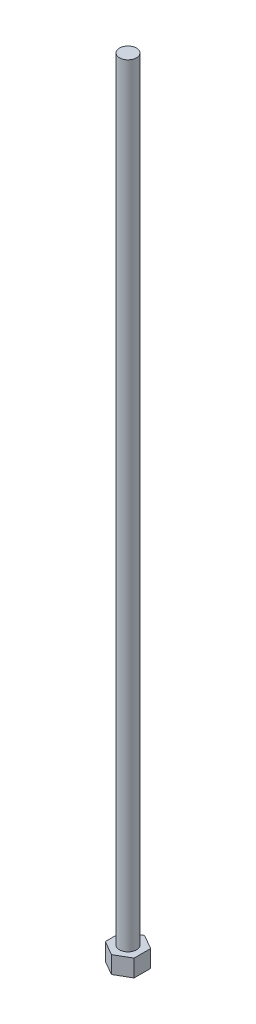
ISO-10303-21;
HEADER;
FILE_DESCRIPTION(('STEP AP214'),'2;1');
FILE_NAME('part.step','',(''),(''),'','','');
FILE_SCHEMA(('AUTOMOTIVE_DESIGN { 1 0 10303 214 1 1 1 1 }'));
ENDSEC;
DATA;
#1=APPLICATION_CONTEXT('core data for automotive mechanical design processes');
#2=APPLICATION_PROTOCOL_DEFINITION('international standard','automotive_design',2000,#1);
#3=PRODUCT_CONTEXT('',#1,'mechanical');
#4=PRODUCT('Part','Part','',(#3));
#5=PRODUCT_RELATED_PRODUCT_CATEGORY('part','',(#4));
#6=PRODUCT_DEFINITION_FORMATION('','',#4);
#7=PRODUCT_DEFINITION_CONTEXT('part definition',#1,'design');
#8=PRODUCT_DEFINITION('design','',#6,#7);
#9=PRODUCT_DEFINITION_SHAPE('','',#8);
#10=(LENGTH_UNIT() NAMED_UNIT(*) SI_UNIT(.MILLI.,.METRE.));
#11=(NAMED_UNIT(*) PLANE_ANGLE_UNIT() SI_UNIT($,.RADIAN.));
#12=(NAMED_UNIT(*) SI_UNIT($,.STERADIAN.) SOLID_ANGLE_UNIT());
#13=UNCERTAINTY_MEASURE_WITH_UNIT(LENGTH_MEASURE(1.E-05),#10,'distance_accuracy_value','');
#14=(GEOMETRIC_REPRESENTATION_CONTEXT(3) GLOBAL_UNCERTAINTY_ASSIGNED_CONTEXT((#13)) GLOBAL_UNIT_ASSIGNED_CONTEXT((#10,
#11,#12)) REPRESENTATION_CONTEXT('',''));
#15=CARTESIAN_POINT('',(0.,0.,0.));
#16=DIRECTION('',(0.,0.,1.));
#17=DIRECTION('',(1.,0.,0.));
#18=AXIS2_PLACEMENT_3D('',#15,#16,#17);
#19=CARTESIAN_POINT('',(5.,6.,-2.88675134594813));
#20=DIRECTION('',(-0.5,0.,0.866025403784439));
#21=DIRECTION('',(0.866025403784439,0.,0.5));
#22=AXIS2_PLACEMENT_3D('',#19,#20,#21);
#23=PLANE('',#22);
#24=DIRECTION('',(-0.866025403784439,0.,-0.5));
#25=VECTOR('',#24,1.);
#26=CARTESIAN_POINT('',(5.,0.,-2.88675134594813));
#27=LINE('',#26,#25);
#28=CARTESIAN_POINT('',(5.,0.,-2.88675134594813));
#29=VERTEX_POINT('',#28);
#30=CARTESIAN_POINT('',(0.,0.,-5.77350269189626));
#31=VERTEX_POINT('',#30);
#32=EDGE_CURVE('E133',#29,#31,#27,.T.);
#33=ORIENTED_EDGE('',*,*,#32,.T.);
#34=DIRECTION('',(0.,-1.,0.));
#35=VECTOR('',#34,1.);
#36=CARTESIAN_POINT('',(0.,6.,-5.77350269189626));
#37=LINE('',#36,#35);
#38=CARTESIAN_POINT('',(0.,6.,-5.77350269189626));
#39=VERTEX_POINT('',#38);
#40=EDGE_CURVE('E50',#39,#31,#37,.T.);
#41=ORIENTED_EDGE('',*,*,#40,.F.);
#42=DIRECTION('',(-0.866025403784439,0.,-0.5));
#43=VECTOR('',#42,1.);
#44=CARTESIAN_POINT('',(5.,6.,-2.88675134594813));
#45=LINE('',#44,#43);
#46=CARTESIAN_POINT('',(5.,6.,-2.88675134594813));
#47=VERTEX_POINT('',#46);
#48=EDGE_CURVE('E144',#47,#39,#45,.T.);
#49=ORIENTED_EDGE('',*,*,#48,.F.);
#50=DIRECTION('',(0.,-1.,0.));
#51=VECTOR('',#50,1.);
#52=CARTESIAN_POINT('',(5.,6.,-2.88675134594813));
#53=LINE('',#52,#51);
#54=EDGE_CURVE('E129',#47,#29,#53,.T.);
#55=ORIENTED_EDGE('',*,*,#54,.T.);
#56=EDGE_LOOP('',(#33,#41,#49,#55));
#57=FACE_BOUND('',#56,.T.);
#58=ADVANCED_FACE('F47',(#57),#23,.F.);
#59=CARTESIAN_POINT('',(0.,6.,-5.77350269189626));
#60=DIRECTION('',(0.5,0.,0.866025403784439));
#61=DIRECTION('',(0.866025403784439,0.,-0.5));
#62=AXIS2_PLACEMENT_3D('',#59,#60,#61);
#63=PLANE('',#62);
#64=DIRECTION('',(-0.866025403784439,0.,0.5));
#65=VECTOR('',#64,1.);
#66=CARTESIAN_POINT('',(0.,0.,-5.77350269189626));
#67=LINE('',#66,#65);
#68=CARTESIAN_POINT('',(-5.,0.,-2.88675134594813));
#69=VERTEX_POINT('',#68);
#70=EDGE_CURVE('E136',#31,#69,#67,.T.);
#71=ORIENTED_EDGE('',*,*,#70,.T.);
#72=DIRECTION('',(0.,-1.,0.));
#73=VECTOR('',#72,1.);
#74=CARTESIAN_POINT('',(-5.,6.,-2.88675134594813));
#75=LINE('',#74,#73);
#76=CARTESIAN_POINT('',(-5.,6.,-2.88675134594813));
#77=VERTEX_POINT('',#76);
#78=EDGE_CURVE('E147',#77,#69,#75,.T.);
#79=ORIENTED_EDGE('',*,*,#78,.F.);
#80=DIRECTION('',(-0.866025403784439,0.,0.5));
#81=VECTOR('',#80,1.);
#82=CARTESIAN_POINT('',(0.,6.,-5.77350269189626));
#83=LINE('',#82,#81);
#84=EDGE_CURVE('E102',#39,#77,#83,.T.);
#85=ORIENTED_EDGE('',*,*,#84,.F.);
#86=ORIENTED_EDGE('',*,*,#40,.T.);
#87=EDGE_LOOP('',(#71,#79,#85,#86));
#88=FACE_BOUND('',#87,.T.);
#89=ADVANCED_FACE('F152',(#88),#63,.F.);
#90=CARTESIAN_POINT('',(-5.,6.,-2.88675134594813));
#91=DIRECTION('',(1.,0.,0.));
#92=DIRECTION('',(0.,0.,-1.));
#93=AXIS2_PLACEMENT_3D('',#90,#91,#92);
#94=PLANE('',#93);
#95=DIRECTION('',(0.,0.,1.));
#96=VECTOR('',#95,1.);
#97=CARTESIAN_POINT('',(-5.,0.,-2.88675134594813));
#98=LINE('',#97,#96);
#99=CARTESIAN_POINT('',(-5.,0.,2.88675134594813));
#100=VERTEX_POINT('',#99);
#101=EDGE_CURVE('E139',#69,#100,#98,.T.);
#102=ORIENTED_EDGE('',*,*,#101,.T.);
#103=DIRECTION('',(0.,-1.,0.));
#104=VECTOR('',#103,1.);
#105=CARTESIAN_POINT('',(-5.,6.,2.88675134594813));
#106=LINE('',#105,#104);
#107=CARTESIAN_POINT('',(-5.,6.,2.88675134594813));
#108=VERTEX_POINT('',#107);
#109=EDGE_CURVE('E124',#108,#100,#106,.T.);
#110=ORIENTED_EDGE('',*,*,#109,.F.);
#111=DIRECTION('',(0.,0.,1.));
#112=VECTOR('',#111,1.);
#113=CARTESIAN_POINT('',(-5.,6.,-2.88675134594813));
#114=LINE('',#113,#112);
#115=EDGE_CURVE('E115',#77,#108,#114,.T.);
#116=ORIENTED_EDGE('',*,*,#115,.F.);
#117=ORIENTED_EDGE('',*,*,#78,.T.);
#118=EDGE_LOOP('',(#102,#110,#116,#117));
#119=FACE_BOUND('',#118,.T.);
#120=ADVANCED_FACE('F158',(#119),#94,.F.);
#121=CARTESIAN_POINT('',(-5.,6.,2.88675134594813));
#122=DIRECTION('',(0.5,0.,-0.866025403784439));
#123=DIRECTION('',(-0.866025403784439,0.,-0.5));
#124=AXIS2_PLACEMENT_3D('',#121,#122,#123);
#125=PLANE('',#124);
#126=DIRECTION('',(0.866025403784439,0.,0.5));
#127=VECTOR('',#126,1.);
#128=CARTESIAN_POINT('',(-5.,0.,2.88675134594813));
#129=LINE('',#128,#127);
#130=CARTESIAN_POINT('',(0.,0.,5.77350269189626));
#131=VERTEX_POINT('',#130);
#132=EDGE_CURVE('E123',#100,#131,#129,.T.);
#133=ORIENTED_EDGE('',*,*,#132,.T.);
#134=DIRECTION('',(0.,-1.,0.));
#135=VECTOR('',#134,1.);
#136=CARTESIAN_POINT('',(0.,6.,5.77350269189626));
#137=LINE('',#136,#135);
#138=CARTESIAN_POINT('',(0.,6.,5.77350269189626));
#139=VERTEX_POINT('',#138);
#140=EDGE_CURVE('E120',#139,#131,#137,.T.);
#141=ORIENTED_EDGE('',*,*,#140,.F.);
#142=DIRECTION('',(0.866025403784439,0.,0.5));
#143=VECTOR('',#142,1.);
#144=CARTESIAN_POINT('',(-5.,6.,2.88675134594813));
#145=LINE('',#144,#143);
#146=EDGE_CURVE('E109',#108,#139,#145,.T.);
#147=ORIENTED_EDGE('',*,*,#146,.F.);
#148=ORIENTED_EDGE('',*,*,#109,.T.);
#149=EDGE_LOOP('',(#133,#141,#147,#148));
#150=FACE_BOUND('',#149,.T.);
#151=ADVANCED_FACE('F121',(#150),#125,.F.);
#152=CARTESIAN_POINT('',(0.,6.,5.77350269189626));
#153=DIRECTION('',(-0.5,0.,-0.866025403784439));
#154=DIRECTION('',(-0.866025403784439,0.,0.5));
#155=AXIS2_PLACEMENT_3D('',#152,#153,#154);
#156=PLANE('',#155);
#157=DIRECTION('',(0.866025403784439,0.,-0.5));
#158=VECTOR('',#157,1.);
#159=CARTESIAN_POINT('',(0.,0.,5.77350269189626));
#160=LINE('',#159,#158);
#161=CARTESIAN_POINT('',(5.,0.,2.88675134594813));
#162=VERTEX_POINT('',#161);
#163=EDGE_CURVE('E87',#131,#162,#160,.T.);
#164=ORIENTED_EDGE('',*,*,#163,.T.);
#165=DIRECTION('',(0.,-1.,0.));
#166=VECTOR('',#165,1.);
#167=CARTESIAN_POINT('',(5.,6.,2.88675134594813));
#168=LINE('',#167,#166);
#169=CARTESIAN_POINT('',(5.,6.,2.88675134594813));
#170=VERTEX_POINT('',#169);
#171=EDGE_CURVE('E125',#170,#162,#168,.T.);
#172=ORIENTED_EDGE('',*,*,#171,.F.);
#173=DIRECTION('',(0.866025403784439,0.,-0.5));
#174=VECTOR('',#173,1.);
#175=CARTESIAN_POINT('',(0.,6.,5.77350269189626));
#176=LINE('',#175,#174);
#177=EDGE_CURVE('E113',#139,#170,#176,.T.);
#178=ORIENTED_EDGE('',*,*,#177,.F.);
#179=ORIENTED_EDGE('',*,*,#140,.T.);
#180=EDGE_LOOP('',(#164,#172,#178,#179));
#181=FACE_BOUND('',#180,.T.);
#182=ADVANCED_FACE('F127',(#181),#156,.F.);
#183=CARTESIAN_POINT('',(5.,6.,2.88675134594813));
#184=DIRECTION('',(-1.,0.,0.));
#185=DIRECTION('',(0.,0.,1.));
#186=AXIS2_PLACEMENT_3D('',#183,#184,#185);
#187=PLANE('',#186);
#188=DIRECTION('',(0.,0.,-1.));
#189=VECTOR('',#188,1.);
#190=CARTESIAN_POINT('',(5.,0.,2.88675134594813));
#191=LINE('',#190,#189);
#192=EDGE_CURVE('E93',#162,#29,#191,.T.);
#193=ORIENTED_EDGE('',*,*,#192,.T.);
#194=ORIENTED_EDGE('',*,*,#54,.F.);
#195=DIRECTION('',(0.,0.,-1.));
#196=VECTOR('',#195,1.);
#197=CARTESIAN_POINT('',(5.,6.,2.88675134594813));
#198=LINE('',#197,#196);
#199=EDGE_CURVE('E64',#170,#47,#198,.T.);
#200=ORIENTED_EDGE('',*,*,#199,.F.);
#201=ORIENTED_EDGE('',*,*,#171,.T.);
#202=EDGE_LOOP('',(#193,#194,#200,#201));
#203=FACE_BOUND('',#202,.T.);
#204=ADVANCED_FACE('F174',(#203),#187,.F.);
#205=CARTESIAN_POINT('',(0.,6.,0.));
#206=DIRECTION('',(0.,1.,0.));
#207=DIRECTION('',(0.,0.,1.));
#208=AXIS2_PLACEMENT_3D('',#205,#206,#207);
#209=PLANE('',#208);
#210=CARTESIAN_POINT('',(0.,6.,0.));
#211=DIRECTION('',(0.,1.,0.));
#212=DIRECTION('',(0.,0.,1.));
#213=AXIS2_PLACEMENT_3D('',#210,#211,#212);
#214=CIRCLE('',#213,2.95);
#215=CARTESIAN_POINT('',(0.,6.,2.95));
#216=VERTEX_POINT('',#215);
#217=EDGE_CURVE('E13',#216,#216,#214,.T.);
#218=ORIENTED_EDGE('',*,*,#217,.F.);
#219=EDGE_LOOP('',(#218));
#220=FACE_BOUND('',#219,.T.);
#221=ORIENTED_EDGE('',*,*,#48,.T.);
#222=ORIENTED_EDGE('',*,*,#84,.T.);
#223=ORIENTED_EDGE('',*,*,#115,.T.);
#224=ORIENTED_EDGE('',*,*,#146,.T.);
#225=ORIENTED_EDGE('',*,*,#177,.T.);
#226=ORIENTED_EDGE('',*,*,#199,.T.);
#227=EDGE_LOOP('',(#221,#222,#223,#224,#225,#226));
#228=FACE_BOUND('',#227,.T.);
#229=ADVANCED_FACE('F111',(#220,#228),#209,.T.);
#230=CARTESIAN_POINT('',(0.,0.,0.));
#231=DIRECTION('',(0.,1.,0.));
#232=DIRECTION('',(0.,0.,1.));
#233=AXIS2_PLACEMENT_3D('',#230,#231,#232);
#234=PLANE('',#233);
#235=ORIENTED_EDGE('',*,*,#32,.F.);
#236=ORIENTED_EDGE('',*,*,#192,.F.);
#237=ORIENTED_EDGE('',*,*,#163,.F.);
#238=ORIENTED_EDGE('',*,*,#132,.F.);
#239=ORIENTED_EDGE('',*,*,#101,.F.);
#240=ORIENTED_EDGE('',*,*,#70,.F.);
#241=EDGE_LOOP('',(#235,#236,#237,#238,#239,#240));
#242=FACE_BOUND('',#241,.T.);
#243=ADVANCED_FACE('F157',(#242),#234,.F.);
#244=CARTESIAN_POINT('',(0.,275.,0.));
#245=DIRECTION('',(0.,-1.,0.));
#246=DIRECTION('',(0.,0.,-1.));
#247=AXIS2_PLACEMENT_3D('',#244,#245,#246);
#248=CYLINDRICAL_SURFACE('',#247,2.95);
#249=CARTESIAN_POINT('',(0.,275.,0.));
#250=DIRECTION('',(0.,1.,0.));
#251=DIRECTION('',(0.,0.,1.));
#252=AXIS2_PLACEMENT_3D('',#249,#250,#251);
#253=CIRCLE('',#252,2.95);
#254=CARTESIAN_POINT('',(0.,275.,2.95));
#255=VERTEX_POINT('',#254);
#256=EDGE_CURVE('E137',#255,#255,#253,.T.);
#257=ORIENTED_EDGE('',*,*,#256,.F.);
#258=EDGE_LOOP('',(#257));
#259=FACE_BOUND('',#258,.T.);
#260=ORIENTED_EDGE('',*,*,#217,.T.);
#261=EDGE_LOOP('',(#260));
#262=FACE_BOUND('',#261,.T.);
#263=ADVANCED_FACE('F167',(#259,#262),#248,.T.);
#264=CARTESIAN_POINT('',(0.,275.,0.));
#265=DIRECTION('',(0.,1.,0.));
#266=DIRECTION('',(0.,0.,1.));
#267=AXIS2_PLACEMENT_3D('',#264,#265,#266);
#268=PLANE('',#267);
#269=ORIENTED_EDGE('',*,*,#256,.T.);
#270=EDGE_LOOP('',(#269));
#271=FACE_BOUND('',#270,.T.);
#272=ADVANCED_FACE('F165',(#271),#268,.T.);
#273=CLOSED_SHELL('',(#58,#89,#120,#151,#182,#204,#229,#243,#263,#272));
#274=MANIFOLD_SOLID_BREP('B2',#273);
#275=ADVANCED_BREP_SHAPE_REPRESENTATION('',(#18,#274),#14);
#276=SHAPE_DEFINITION_REPRESENTATION(#9,#275);
ENDSEC;
END-ISO-10303-21;
